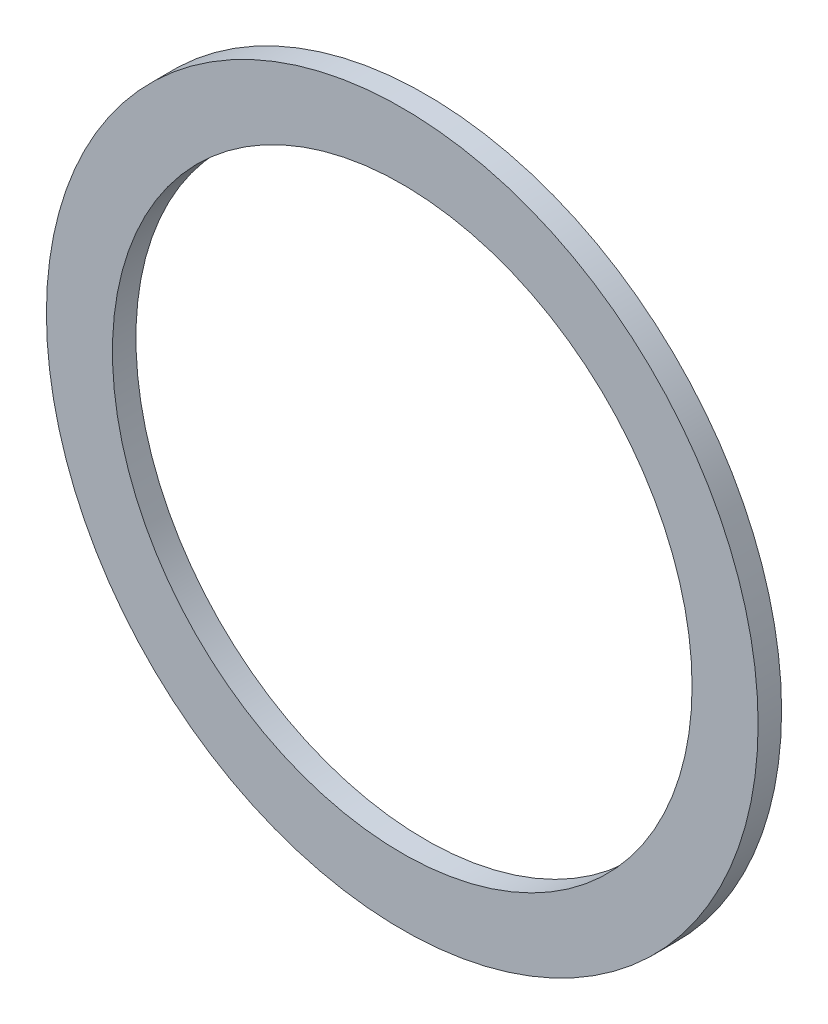
ISO-10303-21;
HEADER;
FILE_DESCRIPTION(('STEP AP214'),'2;1');
FILE_NAME('part.step','',(''),(''),'','','');
FILE_SCHEMA(('AUTOMOTIVE_DESIGN { 1 0 10303 214 1 1 1 1 }'));
ENDSEC;
DATA;
#1=APPLICATION_CONTEXT('core data for automotive mechanical design processes');
#2=APPLICATION_PROTOCOL_DEFINITION('international standard','automotive_design',2000,#1);
#3=PRODUCT_CONTEXT('',#1,'mechanical');
#4=PRODUCT('Part','Part','',(#3));
#5=PRODUCT_RELATED_PRODUCT_CATEGORY('part','',(#4));
#6=PRODUCT_DEFINITION_FORMATION('','',#4);
#7=PRODUCT_DEFINITION_CONTEXT('part definition',#1,'design');
#8=PRODUCT_DEFINITION('design','',#6,#7);
#9=PRODUCT_DEFINITION_SHAPE('','',#8);
#10=(LENGTH_UNIT() NAMED_UNIT(*) SI_UNIT(.MILLI.,.METRE.));
#11=(NAMED_UNIT(*) PLANE_ANGLE_UNIT() SI_UNIT($,.RADIAN.));
#12=(NAMED_UNIT(*) SI_UNIT($,.STERADIAN.) SOLID_ANGLE_UNIT());
#13=UNCERTAINTY_MEASURE_WITH_UNIT(LENGTH_MEASURE(1.E-05),#10,'distance_accuracy_value','');
#14=(GEOMETRIC_REPRESENTATION_CONTEXT(3) GLOBAL_UNCERTAINTY_ASSIGNED_CONTEXT((#13)) GLOBAL_UNIT_ASSIGNED_CONTEXT((#10,
#11,#12)) REPRESENTATION_CONTEXT('',''));
#15=CARTESIAN_POINT('',(0.,0.,0.));
#16=DIRECTION('',(0.,0.,1.));
#17=DIRECTION('',(1.,0.,0.));
#18=AXIS2_PLACEMENT_3D('',#15,#16,#17);
#19=CARTESIAN_POINT('',(0.,0.,0.799999999999995));
#20=DIRECTION('',(0.,0.,1.));
#21=DIRECTION('',(1.,0.,0.));
#22=AXIS2_PLACEMENT_3D('',#19,#20,#21);
#23=PLANE('',#22);
#24=CARTESIAN_POINT('',(1.11022302462516E-13,0.,0.799999999999995));
#25=DIRECTION('',(0.,0.,1.));
#26=DIRECTION('',(1.,0.,0.));
#27=AXIS2_PLACEMENT_3D('',#24,#25,#26);
#28=CIRCLE('',#27,19.75);
#29=CARTESIAN_POINT('',(19.7500000000001,0.,0.799999999999995));
#30=VERTEX_POINT('',#29);
#31=EDGE_CURVE('E23',#30,#30,#28,.T.);
#32=ORIENTED_EDGE('',*,*,#31,.F.);
#33=EDGE_LOOP('',(#32));
#34=FACE_BOUND('',#33,.T.);
#35=CARTESIAN_POINT('',(0.,0.,0.799999999999995));
#36=DIRECTION('',(0.,0.,1.));
#37=DIRECTION('',(1.,0.,0.));
#38=AXIS2_PLACEMENT_3D('',#35,#36,#37);
#39=CIRCLE('',#38,24.25);
#40=CARTESIAN_POINT('',(24.25,0.,0.799999999999995));
#41=VERTEX_POINT('',#40);
#42=EDGE_CURVE('E33',#41,#41,#39,.T.);
#43=ORIENTED_EDGE('',*,*,#42,.T.);
#44=EDGE_LOOP('',(#43));
#45=FACE_BOUND('',#44,.T.);
#46=ADVANCED_FACE('F15',(#34,#45),#23,.T.);
#47=CARTESIAN_POINT('',(0.,0.,-0.799999999999995));
#48=DIRECTION('',(0.,0.,1.));
#49=DIRECTION('',(1.,0.,0.));
#50=AXIS2_PLACEMENT_3D('',#47,#48,#49);
#51=PLANE('',#50);
#52=CARTESIAN_POINT('',(1.11022302462516E-13,0.,-0.799999999999995));
#53=DIRECTION('',(0.,0.,1.));
#54=DIRECTION('',(1.,0.,0.));
#55=AXIS2_PLACEMENT_3D('',#52,#53,#54);
#56=CIRCLE('',#55,19.75);
#57=CARTESIAN_POINT('',(19.7500000000001,0.,-0.799999999999995));
#58=VERTEX_POINT('',#57);
#59=EDGE_CURVE('E10',#58,#58,#56,.T.);
#60=ORIENTED_EDGE('',*,*,#59,.T.);
#61=EDGE_LOOP('',(#60));
#62=FACE_BOUND('',#61,.T.);
#63=CARTESIAN_POINT('',(0.,0.,-0.799999999999995));
#64=DIRECTION('',(0.,0.,1.));
#65=DIRECTION('',(1.,0.,0.));
#66=AXIS2_PLACEMENT_3D('',#63,#64,#65);
#67=CIRCLE('',#66,24.25);
#68=CARTESIAN_POINT('',(24.25,0.,-0.799999999999995));
#69=VERTEX_POINT('',#68);
#70=EDGE_CURVE('E40',#69,#69,#67,.T.);
#71=ORIENTED_EDGE('',*,*,#70,.F.);
#72=EDGE_LOOP('',(#71));
#73=FACE_BOUND('',#72,.T.);
#74=ADVANCED_FACE('F50',(#62,#73),#51,.F.);
#75=CARTESIAN_POINT('',(1.11022302462516E-13,0.,-0.799999999999995));
#76=DIRECTION('',(0.,0.,-1.));
#77=DIRECTION('',(1.,0.,0.));
#78=AXIS2_PLACEMENT_3D('',#75,#76,#77);
#79=CYLINDRICAL_SURFACE('',#78,19.75);
#80=ORIENTED_EDGE('',*,*,#31,.T.);
#81=EDGE_LOOP('',(#80));
#82=FACE_BOUND('',#81,.T.);
#83=ORIENTED_EDGE('',*,*,#59,.F.);
#84=EDGE_LOOP('',(#83));
#85=FACE_BOUND('',#84,.T.);
#86=ADVANCED_FACE('F17',(#82,#85),#79,.F.);
#87=CARTESIAN_POINT('',(0.,0.,-0.799999999999995));
#88=DIRECTION('',(0.,0.,-1.));
#89=DIRECTION('',(1.,0.,0.));
#90=AXIS2_PLACEMENT_3D('',#87,#88,#89);
#91=CYLINDRICAL_SURFACE('',#90,24.25);
#92=ORIENTED_EDGE('',*,*,#42,.F.);
#93=EDGE_LOOP('',(#92));
#94=FACE_BOUND('',#93,.T.);
#95=ORIENTED_EDGE('',*,*,#70,.T.);
#96=EDGE_LOOP('',(#95));
#97=FACE_BOUND('',#96,.T.);
#98=ADVANCED_FACE('F44',(#94,#97),#91,.T.);
#99=CLOSED_SHELL('',(#46,#74,#86,#98));
#100=MANIFOLD_SOLID_BREP('B1',#99);
#101=ADVANCED_BREP_SHAPE_REPRESENTATION('',(#18,#100),#14);
#102=SHAPE_DEFINITION_REPRESENTATION(#9,#101);
ENDSEC;
END-ISO-10303-21;
